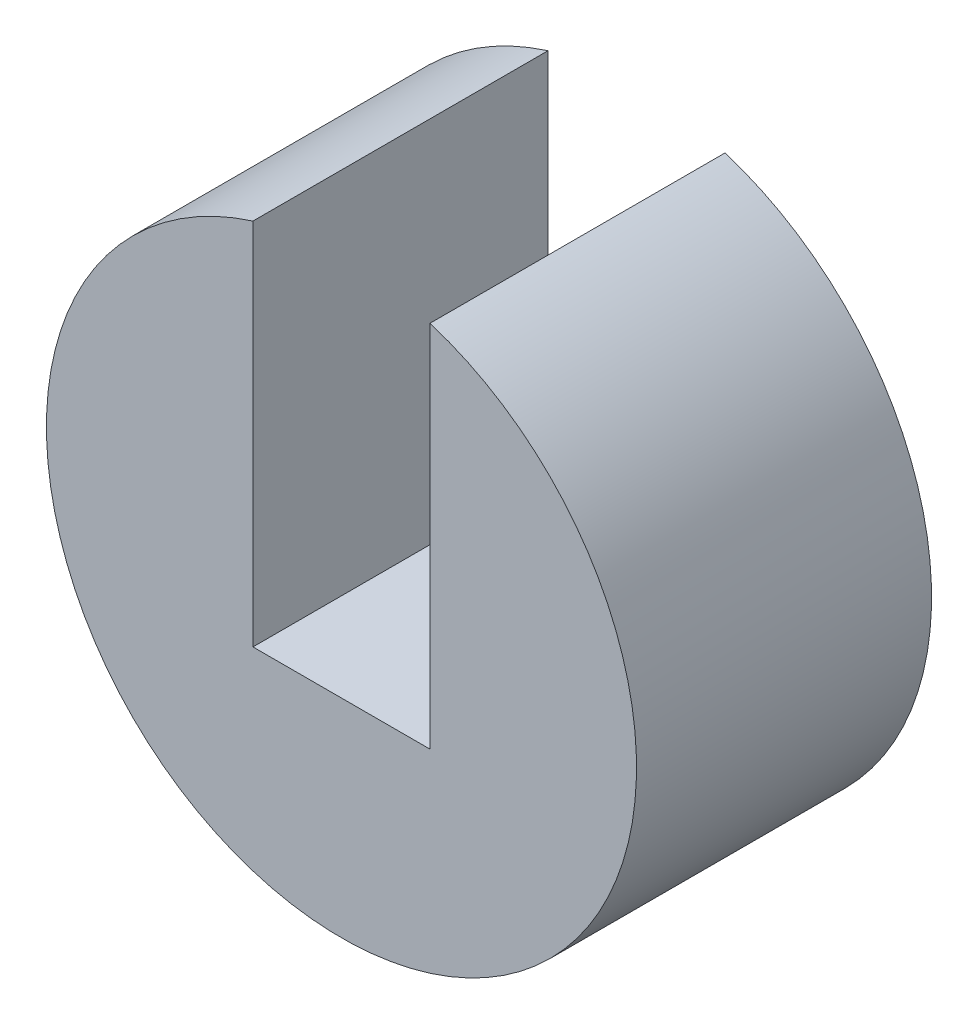
ISO-10303-21;
HEADER;
FILE_DESCRIPTION(('STEP AP214'),'2;1');
FILE_NAME('part.step','',(''),(''),'','','');
FILE_SCHEMA(('AUTOMOTIVE_DESIGN { 1 0 10303 214 1 1 1 1 }'));
ENDSEC;
DATA;
#1=APPLICATION_CONTEXT('core data for automotive mechanical design processes');
#2=APPLICATION_PROTOCOL_DEFINITION('international standard','automotive_design',2000,#1);
#3=PRODUCT_CONTEXT('',#1,'mechanical');
#4=PRODUCT('Part','Part','',(#3));
#5=PRODUCT_RELATED_PRODUCT_CATEGORY('part','',(#4));
#6=PRODUCT_DEFINITION_FORMATION('','',#4);
#7=PRODUCT_DEFINITION_CONTEXT('part definition',#1,'design');
#8=PRODUCT_DEFINITION('design','',#6,#7);
#9=PRODUCT_DEFINITION_SHAPE('','',#8);
#10=(LENGTH_UNIT() NAMED_UNIT(*) SI_UNIT(.MILLI.,.METRE.));
#11=(NAMED_UNIT(*) PLANE_ANGLE_UNIT() SI_UNIT($,.RADIAN.));
#12=(NAMED_UNIT(*) SI_UNIT($,.STERADIAN.) SOLID_ANGLE_UNIT());
#13=UNCERTAINTY_MEASURE_WITH_UNIT(LENGTH_MEASURE(1.E-05),#10,'distance_accuracy_value','');
#14=(GEOMETRIC_REPRESENTATION_CONTEXT(3) GLOBAL_UNCERTAINTY_ASSIGNED_CONTEXT((#13)) GLOBAL_UNIT_ASSIGNED_CONTEXT((#10,
#11,#12)) REPRESENTATION_CONTEXT('',''));
#15=CARTESIAN_POINT('',(0.,0.,0.));
#16=DIRECTION('',(0.,0.,1.));
#17=DIRECTION('',(1.,0.,0.));
#18=AXIS2_PLACEMENT_3D('',#15,#16,#17);
#19=CARTESIAN_POINT('',(-1.5,0.,5.));
#20=DIRECTION('',(1.,0.,0.));
#21=DIRECTION('',(0.,1.,0.));
#22=AXIS2_PLACEMENT_3D('',#19,#20,#21);
#23=PLANE('',#22);
#24=DIRECTION('',(0.,-1.,0.));
#25=VECTOR('',#24,1.);
#26=CARTESIAN_POINT('',(-1.5,0.,0.));
#27=LINE('',#26,#25);
#28=CARTESIAN_POINT('',(-1.5,3.125,0.));
#29=VERTEX_POINT('',#28);
#30=CARTESIAN_POINT('',(-1.5,-3.125,0.));
#31=VERTEX_POINT('',#30);
#32=EDGE_CURVE('E94',#29,#31,#27,.T.);
#33=ORIENTED_EDGE('',*,*,#32,.F.);
#34=DIRECTION('',(0.,0.,-1.));
#35=VECTOR('',#34,1.);
#36=CARTESIAN_POINT('',(-1.5,3.125,5.));
#37=LINE('',#36,#35);
#38=CARTESIAN_POINT('',(-1.5,3.125,5.));
#39=VERTEX_POINT('',#38);
#40=EDGE_CURVE('E11',#39,#29,#37,.T.);
#41=ORIENTED_EDGE('',*,*,#40,.F.);
#42=DIRECTION('',(0.,-1.,0.));
#43=VECTOR('',#42,1.);
#44=CARTESIAN_POINT('',(-1.5,0.,5.));
#45=LINE('',#44,#43);
#46=CARTESIAN_POINT('',(-1.5,-3.125,5.));
#47=VERTEX_POINT('',#46);
#48=EDGE_CURVE('E82',#39,#47,#45,.T.);
#49=ORIENTED_EDGE('',*,*,#48,.T.);
#50=DIRECTION('',(0.,0.,-1.));
#51=VECTOR('',#50,1.);
#52=CARTESIAN_POINT('',(-1.5,-3.125,5.));
#53=LINE('',#52,#51);
#54=EDGE_CURVE('E71',#47,#31,#53,.T.);
#55=ORIENTED_EDGE('',*,*,#54,.T.);
#56=EDGE_LOOP('',(#33,#41,#49,#55));
#57=FACE_BOUND('',#56,.T.);
#58=ADVANCED_FACE('F32',(#57),#23,.T.);
#59=CARTESIAN_POINT('',(0.,-1.64469600708473,5.));
#60=DIRECTION('',(0.,0.,-1.));
#61=DIRECTION('',(-1.,0.,0.));
#62=AXIS2_PLACEMENT_3D('',#59,#60,#61);
#63=CYLINDRICAL_SURFACE('',#62,5.);
#64=CARTESIAN_POINT('',(0.,-1.64469600708473,0.));
#65=DIRECTION('',(0.,0.,1.));
#66=DIRECTION('',(1.,0.,0.));
#67=AXIS2_PLACEMENT_3D('',#64,#65,#66);
#68=CIRCLE('',#67,5.);
#69=CARTESIAN_POINT('',(1.5,3.125,0.));
#70=VERTEX_POINT('',#69);
#71=EDGE_CURVE('E87',#29,#70,#68,.T.);
#72=ORIENTED_EDGE('',*,*,#71,.T.);
#73=DIRECTION('',(0.,0.,-1.));
#74=VECTOR('',#73,1.);
#75=CARTESIAN_POINT('',(1.5,3.125,5.));
#76=LINE('',#75,#74);
#77=CARTESIAN_POINT('',(1.5,3.125,5.));
#78=VERTEX_POINT('',#77);
#79=EDGE_CURVE('E40',#78,#70,#76,.T.);
#80=ORIENTED_EDGE('',*,*,#79,.F.);
#81=CARTESIAN_POINT('',(0.,-1.64469600708473,5.));
#82=DIRECTION('',(0.,0.,1.));
#83=DIRECTION('',(1.,0.,0.));
#84=AXIS2_PLACEMENT_3D('',#81,#82,#83);
#85=CIRCLE('',#84,5.);
#86=EDGE_CURVE('E77',#39,#78,#85,.T.);
#87=ORIENTED_EDGE('',*,*,#86,.F.);
#88=ORIENTED_EDGE('',*,*,#40,.T.);
#89=EDGE_LOOP('',(#72,#80,#87,#88));
#90=FACE_BOUND('',#89,.T.);
#91=ADVANCED_FACE('F85',(#90),#63,.T.);
#92=CARTESIAN_POINT('',(1.5,0.,5.));
#93=DIRECTION('',(1.,0.,0.));
#94=DIRECTION('',(0.,1.,0.));
#95=AXIS2_PLACEMENT_3D('',#92,#93,#94);
#96=PLANE('',#95);
#97=DIRECTION('',(0.,-1.,0.));
#98=VECTOR('',#97,1.);
#99=CARTESIAN_POINT('',(1.5,0.,0.));
#100=LINE('',#99,#98);
#101=CARTESIAN_POINT('',(1.5,-3.125,0.));
#102=VERTEX_POINT('',#101);
#103=EDGE_CURVE('E64',#70,#102,#100,.T.);
#104=ORIENTED_EDGE('',*,*,#103,.T.);
#105=DIRECTION('',(0.,0.,-1.));
#106=VECTOR('',#105,1.);
#107=CARTESIAN_POINT('',(1.5,-3.125,5.));
#108=LINE('',#107,#106);
#109=CARTESIAN_POINT('',(1.5,-3.125,5.));
#110=VERTEX_POINT('',#109);
#111=EDGE_CURVE('E88',#110,#102,#108,.T.);
#112=ORIENTED_EDGE('',*,*,#111,.F.);
#113=DIRECTION('',(0.,-1.,0.));
#114=VECTOR('',#113,1.);
#115=CARTESIAN_POINT('',(1.5,0.,5.));
#116=LINE('',#115,#114);
#117=EDGE_CURVE('E81',#78,#110,#116,.T.);
#118=ORIENTED_EDGE('',*,*,#117,.F.);
#119=ORIENTED_EDGE('',*,*,#79,.T.);
#120=EDGE_LOOP('',(#104,#112,#118,#119));
#121=FACE_BOUND('',#120,.T.);
#122=ADVANCED_FACE('F89',(#121),#96,.F.);
#123=CARTESIAN_POINT('',(0.,-3.125,5.));
#124=DIRECTION('',(0.,-1.,0.));
#125=DIRECTION('',(0.,0.,-1.));
#126=AXIS2_PLACEMENT_3D('',#123,#124,#125);
#127=PLANE('',#126);
#128=DIRECTION('',(-1.,0.,0.));
#129=VECTOR('',#128,1.);
#130=CARTESIAN_POINT('',(0.,-3.125,0.));
#131=LINE('',#130,#129);
#132=EDGE_CURVE('E99',#102,#31,#131,.T.);
#133=ORIENTED_EDGE('',*,*,#132,.T.);
#134=ORIENTED_EDGE('',*,*,#54,.F.);
#135=DIRECTION('',(-1.,0.,0.));
#136=VECTOR('',#135,1.);
#137=CARTESIAN_POINT('',(0.,-3.125,5.));
#138=LINE('',#137,#136);
#139=EDGE_CURVE('E48',#110,#47,#138,.T.);
#140=ORIENTED_EDGE('',*,*,#139,.F.);
#141=ORIENTED_EDGE('',*,*,#111,.T.);
#142=EDGE_LOOP('',(#133,#134,#140,#141));
#143=FACE_BOUND('',#142,.T.);
#144=ADVANCED_FACE('F104',(#143),#127,.F.);
#145=CARTESIAN_POINT('',(0.,0.,5.));
#146=DIRECTION('',(0.,0.,1.));
#147=DIRECTION('',(1.,0.,0.));
#148=AXIS2_PLACEMENT_3D('',#145,#146,#147);
#149=PLANE('',#148);
#150=ORIENTED_EDGE('',*,*,#48,.F.);
#151=ORIENTED_EDGE('',*,*,#86,.T.);
#152=ORIENTED_EDGE('',*,*,#117,.T.);
#153=ORIENTED_EDGE('',*,*,#139,.T.);
#154=EDGE_LOOP('',(#150,#151,#152,#153));
#155=FACE_BOUND('',#154,.T.);
#156=ADVANCED_FACE('F79',(#155),#149,.T.);
#157=CARTESIAN_POINT('',(0.,0.,0.));
#158=DIRECTION('',(0.,0.,1.));
#159=DIRECTION('',(1.,0.,0.));
#160=AXIS2_PLACEMENT_3D('',#157,#158,#159);
#161=PLANE('',#160);
#162=ORIENTED_EDGE('',*,*,#32,.T.);
#163=ORIENTED_EDGE('',*,*,#132,.F.);
#164=ORIENTED_EDGE('',*,*,#103,.F.);
#165=ORIENTED_EDGE('',*,*,#71,.F.);
#166=EDGE_LOOP('',(#162,#163,#164,#165));
#167=FACE_BOUND('',#166,.T.);
#168=ADVANCED_FACE('F106',(#167),#161,.F.);
#169=CLOSED_SHELL('',(#58,#91,#122,#144,#156,#168));
#170=MANIFOLD_SOLID_BREP('B2',#169);
#171=ADVANCED_BREP_SHAPE_REPRESENTATION('',(#18,#170),#14);
#172=SHAPE_DEFINITION_REPRESENTATION(#9,#171);
ENDSEC;
END-ISO-10303-21;
